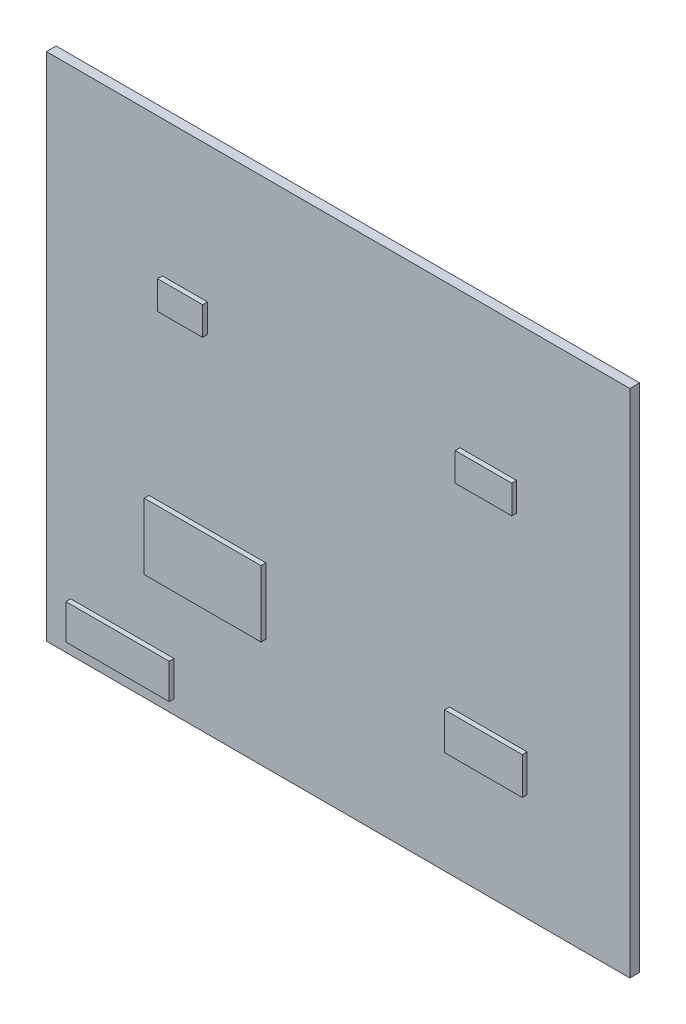
ISO-10303-21;
HEADER;
FILE_DESCRIPTION(('STEP AP214'),'2;1');
FILE_NAME('part.step','',(''),(''),'','','');
FILE_SCHEMA(('AUTOMOTIVE_DESIGN { 1 0 10303 214 1 1 1 1 }'));
ENDSEC;
DATA;
#1=APPLICATION_CONTEXT('core data for automotive mechanical design processes');
#2=APPLICATION_PROTOCOL_DEFINITION('international standard','automotive_design',2000,#1);
#3=PRODUCT_CONTEXT('',#1,'mechanical');
#4=PRODUCT('Part','Part','',(#3));
#5=PRODUCT_RELATED_PRODUCT_CATEGORY('part','',(#4));
#6=PRODUCT_DEFINITION_FORMATION('','',#4);
#7=PRODUCT_DEFINITION_CONTEXT('part definition',#1,'design');
#8=PRODUCT_DEFINITION('design','',#6,#7);
#9=PRODUCT_DEFINITION_SHAPE('','',#8);
#10=(LENGTH_UNIT() NAMED_UNIT(*) SI_UNIT(.MILLI.,.METRE.));
#11=(NAMED_UNIT(*) PLANE_ANGLE_UNIT() SI_UNIT($,.RADIAN.));
#12=(NAMED_UNIT(*) SI_UNIT($,.STERADIAN.) SOLID_ANGLE_UNIT());
#13=UNCERTAINTY_MEASURE_WITH_UNIT(LENGTH_MEASURE(1.E-05),#10,'distance_accuracy_value','');
#14=(GEOMETRIC_REPRESENTATION_CONTEXT(3) GLOBAL_UNCERTAINTY_ASSIGNED_CONTEXT((#13)) GLOBAL_UNIT_ASSIGNED_CONTEXT((#10,
#11,#12)) REPRESENTATION_CONTEXT('',''));
#15=CARTESIAN_POINT('',(0.,0.,0.));
#16=DIRECTION('',(0.,0.,1.));
#17=DIRECTION('',(1.,0.,0.));
#18=AXIS2_PLACEMENT_3D('',#15,#16,#17);
#19=CARTESIAN_POINT('',(0.,0.,2.));
#20=DIRECTION('',(0.,0.,-1.));
#21=DIRECTION('',(-1.,0.,0.));
#22=AXIS2_PLACEMENT_3D('',#19,#20,#21);
#23=PLANE('',#22);
#24=DIRECTION('',(0.,1.,0.));
#25=VECTOR('',#24,1.);
#26=CARTESIAN_POINT('',(36.7081193987389,18.6658341987709,2.));
#27=LINE('',#26,#25);
#28=CARTESIAN_POINT('',(36.7081193987389,18.6658341987709,2.));
#29=VERTEX_POINT('',#28);
#30=CARTESIAN_POINT('',(36.7081193987389,24.4802145211338,2.));
#31=VERTEX_POINT('',#30);
#32=EDGE_CURVE('E217',#29,#31,#27,.T.);
#33=ORIENTED_EDGE('',*,*,#32,.F.);
#34=DIRECTION('',(1.,0.,0.));
#35=VECTOR('',#34,1.);
#36=CARTESIAN_POINT('',(25.0597630125782,18.6658341987709,2.));
#37=LINE('',#36,#35);
#38=CARTESIAN_POINT('',(25.0597630125782,18.6658341987709,2.));
#39=VERTEX_POINT('',#38);
#40=EDGE_CURVE('E230',#39,#29,#37,.T.);
#41=ORIENTED_EDGE('',*,*,#40,.F.);
#42=DIRECTION('',(0.,-1.,0.));
#43=VECTOR('',#42,1.);
#44=CARTESIAN_POINT('',(25.0597630125782,18.6658341987709,2.));
#45=LINE('',#44,#43);
#46=CARTESIAN_POINT('',(25.0597630125782,24.4802145211338,2.));
#47=VERTEX_POINT('',#46);
#48=EDGE_CURVE('E239',#47,#39,#45,.T.);
#49=ORIENTED_EDGE('',*,*,#48,.F.);
#50=DIRECTION('',(-1.,0.,0.));
#51=VECTOR('',#50,1.);
#52=CARTESIAN_POINT('',(25.0597630125782,24.4802145211338,2.));
#53=LINE('',#52,#51);
#54=EDGE_CURVE('E220',#31,#47,#53,.T.);
#55=ORIENTED_EDGE('',*,*,#54,.F.);
#56=EDGE_LOOP('',(#33,#41,#49,#55));
#57=FACE_BOUND('',#56,.T.);
#58=DIRECTION('',(0.,1.,0.));
#59=VECTOR('',#58,1.);
#60=CARTESIAN_POINT('',(38.8723681244443,-30.4180371426241,2.));
#61=LINE('',#60,#59);
#62=CARTESIAN_POINT('',(38.8723681244443,-30.4180371426241,2.));
#63=VERTEX_POINT('',#62);
#64=CARTESIAN_POINT('',(38.8723681244443,-22.7841234165567,2.));
#65=VERTEX_POINT('',#64);
#66=EDGE_CURVE('E288',#63,#65,#61,.T.);
#67=ORIENTED_EDGE('',*,*,#66,.F.);
#68=DIRECTION('',(1.,0.,0.));
#69=VECTOR('',#68,1.);
#70=CARTESIAN_POINT('',(22.8955142868728,-30.4180371426241,2.));
#71=LINE('',#70,#69);
#72=CARTESIAN_POINT('',(22.8955142868728,-30.4180371426241,2.));
#73=VERTEX_POINT('',#72);
#74=EDGE_CURVE('E293',#73,#63,#71,.T.);
#75=ORIENTED_EDGE('',*,*,#74,.F.);
#76=DIRECTION('',(0.,-1.,0.));
#77=VECTOR('',#76,1.);
#78=CARTESIAN_POINT('',(22.8955142868728,-30.4180371426241,2.));
#79=LINE('',#78,#77);
#80=CARTESIAN_POINT('',(22.8955142868728,-22.7841234165567,2.));
#81=VERTEX_POINT('',#80);
#82=EDGE_CURVE('E305',#81,#73,#79,.T.);
#83=ORIENTED_EDGE('',*,*,#82,.F.);
#84=DIRECTION('',(-1.,0.,0.));
#85=VECTOR('',#84,1.);
#86=CARTESIAN_POINT('',(22.8955142868728,-22.7841234165567,2.));
#87=LINE('',#86,#85);
#88=EDGE_CURVE('E302',#65,#81,#87,.T.);
#89=ORIENTED_EDGE('',*,*,#88,.F.);
#90=EDGE_LOOP('',(#67,#75,#83,#89));
#91=FACE_BOUND('',#90,.T.);
#92=DIRECTION('',(0.,1.,0.));
#93=VECTOR('',#92,1.);
#94=CARTESIAN_POINT('',(60.,-52.5,2.));
#95=LINE('',#94,#93);
#96=CARTESIAN_POINT('',(60.,-52.5,2.));
#97=VERTEX_POINT('',#96);
#98=CARTESIAN_POINT('',(60.,52.5,2.));
#99=VERTEX_POINT('',#98);
#100=EDGE_CURVE('E355',#97,#99,#95,.T.);
#101=ORIENTED_EDGE('',*,*,#100,.T.);
#102=DIRECTION('',(-1.,0.,0.));
#103=VECTOR('',#102,1.);
#104=CARTESIAN_POINT('',(-60.,52.5,2.));
#105=LINE('',#104,#103);
#106=CARTESIAN_POINT('',(-60.,52.5,2.));
#107=VERTEX_POINT('',#106);
#108=EDGE_CURVE('E358',#99,#107,#105,.T.);
#109=ORIENTED_EDGE('',*,*,#108,.T.);
#110=DIRECTION('',(0.,-1.,0.));
#111=VECTOR('',#110,1.);
#112=CARTESIAN_POINT('',(-60.,-52.5,2.));
#113=LINE('',#112,#111);
#114=CARTESIAN_POINT('',(-60.,-52.5,2.));
#115=VERTEX_POINT('',#114);
#116=EDGE_CURVE('E361',#107,#115,#113,.T.);
#117=ORIENTED_EDGE('',*,*,#116,.T.);
#118=DIRECTION('',(1.,0.,0.));
#119=VECTOR('',#118,1.);
#120=CARTESIAN_POINT('',(-60.,-52.5,2.));
#121=LINE('',#120,#119);
#122=EDGE_CURVE('E363',#115,#97,#121,.T.);
#123=ORIENTED_EDGE('',*,*,#122,.T.);
#124=EDGE_LOOP('',(#101,#109,#117,#123));
#125=FACE_BOUND('',#124,.T.);
#126=DIRECTION('',(0.,1.,0.));
#127=VECTOR('',#126,1.);
#128=CARTESIAN_POINT('',(-14.8556429378743,-29.5864903580991,2.));
#129=LINE('',#128,#127);
#130=CARTESIAN_POINT('',(-14.8556429378743,-29.5864903580991,2.));
#131=VERTEX_POINT('',#130);
#132=CARTESIAN_POINT('',(-14.8556429378743,-15.9817564750142,2.));
#133=VERTEX_POINT('',#132);
#134=EDGE_CURVE('E321',#131,#133,#129,.T.);
#135=ORIENTED_EDGE('',*,*,#134,.F.);
#136=DIRECTION('',(1.,0.,0.));
#137=VECTOR('',#136,1.);
#138=CARTESIAN_POINT('',(-38.8762767061337,-29.5864903580991,2.));
#139=LINE('',#138,#137);
#140=CARTESIAN_POINT('',(-38.8762767061337,-29.5864903580991,2.));
#141=VERTEX_POINT('',#140);
#142=EDGE_CURVE('E326',#141,#131,#139,.T.);
#143=ORIENTED_EDGE('',*,*,#142,.F.);
#144=DIRECTION('',(0.,-1.,0.));
#145=VECTOR('',#144,1.);
#146=CARTESIAN_POINT('',(-38.8762767061337,-29.5864903580991,2.));
#147=LINE('',#146,#145);
#148=CARTESIAN_POINT('',(-38.8762767061337,-15.9817564750142,2.));
#149=VERTEX_POINT('',#148);
#150=EDGE_CURVE('E338',#149,#141,#147,.T.);
#151=ORIENTED_EDGE('',*,*,#150,.F.);
#152=DIRECTION('',(-1.,0.,0.));
#153=VECTOR('',#152,1.);
#154=CARTESIAN_POINT('',(-38.8762767061337,-15.9817564750142,2.));
#155=LINE('',#154,#153);
#156=EDGE_CURVE('E335',#133,#149,#155,.T.);
#157=ORIENTED_EDGE('',*,*,#156,.F.);
#158=EDGE_LOOP('',(#135,#143,#151,#157));
#159=FACE_BOUND('',#158,.T.);
#160=DIRECTION('',(0.,1.,0.));
#161=VECTOR('',#160,1.);
#162=CARTESIAN_POINT('',(-26.865959822004,18.6658341987709,2.));
#163=LINE('',#162,#161);
#164=CARTESIAN_POINT('',(-26.865959822004,18.6658341987709,2.));
#165=VERTEX_POINT('',#164);
#166=CARTESIAN_POINT('',(-26.865959822004,24.4802145211338,2.));
#167=VERTEX_POINT('',#166);
#168=EDGE_CURVE('E255',#165,#167,#163,.T.);
#169=ORIENTED_EDGE('',*,*,#168,.F.);
#170=DIRECTION('',(1.,0.,0.));
#171=VECTOR('',#170,1.);
#172=CARTESIAN_POINT('',(-36.1530852370606,18.6658341987709,2.));
#173=LINE('',#172,#171);
#174=CARTESIAN_POINT('',(-36.1530852370606,18.6658341987709,2.));
#175=VERTEX_POINT('',#174);
#176=EDGE_CURVE('E260',#175,#165,#173,.T.);
#177=ORIENTED_EDGE('',*,*,#176,.F.);
#178=DIRECTION('',(0.,-1.,0.));
#179=VECTOR('',#178,1.);
#180=CARTESIAN_POINT('',(-36.1530852370606,18.6658341987709,2.));
#181=LINE('',#180,#179);
#182=CARTESIAN_POINT('',(-36.1530852370606,24.4802145211338,2.));
#183=VERTEX_POINT('',#182);
#184=EDGE_CURVE('E272',#183,#175,#181,.T.);
#185=ORIENTED_EDGE('',*,*,#184,.F.);
#186=DIRECTION('',(-1.,0.,0.));
#187=VECTOR('',#186,1.);
#188=CARTESIAN_POINT('',(-36.1530852370606,24.4802145211338,2.));
#189=LINE('',#188,#187);
#190=EDGE_CURVE('E269',#167,#183,#189,.T.);
#191=ORIENTED_EDGE('',*,*,#190,.F.);
#192=EDGE_LOOP('',(#169,#177,#185,#191));
#193=FACE_BOUND('',#192,.T.);
#194=DIRECTION('',(0.,1.,0.));
#195=VECTOR('',#194,1.);
#196=CARTESIAN_POINT('',(-33.7473265030184,-49.6478925465453,2.));
#197=LINE('',#196,#195);
#198=CARTESIAN_POINT('',(-33.7473265030184,-49.6478925465453,2.));
#199=VERTEX_POINT('',#198);
#200=CARTESIAN_POINT('',(-33.7473265030184,-42.4579754762817,2.));
#201=VERTEX_POINT('',#200);
#202=EDGE_CURVE('E216',#199,#201,#197,.T.);
#203=ORIENTED_EDGE('',*,*,#202,.F.);
#204=DIRECTION('',(1.,0.,0.));
#205=VECTOR('',#204,1.);
#206=CARTESIAN_POINT('',(-55.0149263755628,-49.6478925465453,2.));
#207=LINE('',#206,#205);
#208=CARTESIAN_POINT('',(-55.0149263755628,-49.6478925465453,2.));
#209=VERTEX_POINT('',#208);
#210=EDGE_CURVE('E213',#209,#199,#207,.T.);
#211=ORIENTED_EDGE('',*,*,#210,.F.);
#212=DIRECTION('',(0.,-1.,0.));
#213=VECTOR('',#212,1.);
#214=CARTESIAN_POINT('',(-55.0149263755628,-49.6478925465453,2.));
#215=LINE('',#214,#213);
#216=CARTESIAN_POINT('',(-55.0149263755628,-42.4579754762817,2.));
#217=VERTEX_POINT('',#216);
#218=EDGE_CURVE('E55',#217,#209,#215,.T.);
#219=ORIENTED_EDGE('',*,*,#218,.F.);
#220=DIRECTION('',(-1.,0.,0.));
#221=VECTOR('',#220,1.);
#222=CARTESIAN_POINT('',(-55.0149263755628,-42.4579754762817,2.));
#223=LINE('',#222,#221);
#224=EDGE_CURVE('E50',#201,#217,#223,.T.);
#225=ORIENTED_EDGE('',*,*,#224,.F.);
#226=EDGE_LOOP('',(#203,#211,#219,#225));
#227=FACE_BOUND('',#226,.T.);
#228=ADVANCED_FACE('F35',(#57,#91,#125,#159,#193,#227),#23,.F.);
#229=CARTESIAN_POINT('',(60.,-52.5,2.));
#230=DIRECTION('',(-1.,0.,0.));
#231=DIRECTION('',(0.,0.,1.));
#232=AXIS2_PLACEMENT_3D('',#229,#230,#231);
#233=PLANE('',#232);
#234=DIRECTION('',(0.,1.,0.));
#235=VECTOR('',#234,1.);
#236=CARTESIAN_POINT('',(60.,-52.5,0.));
#237=LINE('',#236,#235);
#238=CARTESIAN_POINT('',(60.,-52.5,0.));
#239=VERTEX_POINT('',#238);
#240=CARTESIAN_POINT('',(60.,52.5,0.));
#241=VERTEX_POINT('',#240);
#242=EDGE_CURVE('E354',#239,#241,#237,.T.);
#243=ORIENTED_EDGE('',*,*,#242,.T.);
#244=DIRECTION('',(0.,0.,-1.));
#245=VECTOR('',#244,1.);
#246=CARTESIAN_POINT('',(60.,52.5,2.));
#247=LINE('',#246,#245);
#248=EDGE_CURVE('E11',#99,#241,#247,.T.);
#249=ORIENTED_EDGE('',*,*,#248,.F.);
#250=ORIENTED_EDGE('',*,*,#100,.F.);
#251=DIRECTION('',(0.,0.,-1.));
#252=VECTOR('',#251,1.);
#253=CARTESIAN_POINT('',(60.,-52.5,2.));
#254=LINE('',#253,#252);
#255=EDGE_CURVE('E365',#97,#239,#254,.T.);
#256=ORIENTED_EDGE('',*,*,#255,.T.);
#257=EDGE_LOOP('',(#243,#249,#250,#256));
#258=FACE_BOUND('',#257,.T.);
#259=ADVANCED_FACE('F37',(#258),#233,.F.);
#260=CARTESIAN_POINT('',(-60.,52.5,2.));
#261=DIRECTION('',(0.,-1.,0.));
#262=DIRECTION('',(0.,0.,-1.));
#263=AXIS2_PLACEMENT_3D('',#260,#261,#262);
#264=PLANE('',#263);
#265=DIRECTION('',(-1.,0.,0.));
#266=VECTOR('',#265,1.);
#267=CARTESIAN_POINT('',(-60.,52.5,0.));
#268=LINE('',#267,#266);
#269=CARTESIAN_POINT('',(-60.,52.5,0.));
#270=VERTEX_POINT('',#269);
#271=EDGE_CURVE('E368',#241,#270,#268,.T.);
#272=ORIENTED_EDGE('',*,*,#271,.T.);
#273=DIRECTION('',(0.,0.,-1.));
#274=VECTOR('',#273,1.);
#275=CARTESIAN_POINT('',(-60.,52.5,2.));
#276=LINE('',#275,#274);
#277=EDGE_CURVE('E43',#107,#270,#276,.T.);
#278=ORIENTED_EDGE('',*,*,#277,.F.);
#279=ORIENTED_EDGE('',*,*,#108,.F.);
#280=ORIENTED_EDGE('',*,*,#248,.T.);
#281=EDGE_LOOP('',(#272,#278,#279,#280));
#282=FACE_BOUND('',#281,.T.);
#283=ADVANCED_FACE('F398',(#282),#264,.F.);
#284=CARTESIAN_POINT('',(-60.,-52.5,2.));
#285=DIRECTION('',(1.,0.,0.));
#286=DIRECTION('',(0.,0.,-1.));
#287=AXIS2_PLACEMENT_3D('',#284,#285,#286);
#288=PLANE('',#287);
#289=DIRECTION('',(0.,-1.,0.));
#290=VECTOR('',#289,1.);
#291=CARTESIAN_POINT('',(-60.,-52.5,0.));
#292=LINE('',#291,#290);
#293=CARTESIAN_POINT('',(-60.,-52.5,0.));
#294=VERTEX_POINT('',#293);
#295=EDGE_CURVE('E370',#270,#294,#292,.T.);
#296=ORIENTED_EDGE('',*,*,#295,.T.);
#297=DIRECTION('',(0.,0.,-1.));
#298=VECTOR('',#297,1.);
#299=CARTESIAN_POINT('',(-60.,-52.5,2.));
#300=LINE('',#299,#298);
#301=EDGE_CURVE('E375',#115,#294,#300,.T.);
#302=ORIENTED_EDGE('',*,*,#301,.F.);
#303=ORIENTED_EDGE('',*,*,#116,.F.);
#304=ORIENTED_EDGE('',*,*,#277,.T.);
#305=EDGE_LOOP('',(#296,#302,#303,#304));
#306=FACE_BOUND('',#305,.T.);
#307=ADVANCED_FACE('F382',(#306),#288,.F.);
#308=CARTESIAN_POINT('',(-60.,-52.5,2.));
#309=DIRECTION('',(0.,1.,0.));
#310=DIRECTION('',(0.,0.,1.));
#311=AXIS2_PLACEMENT_3D('',#308,#309,#310);
#312=PLANE('',#311);
#313=DIRECTION('',(1.,0.,0.));
#314=VECTOR('',#313,1.);
#315=CARTESIAN_POINT('',(-60.,-52.5,0.));
#316=LINE('',#315,#314);
#317=EDGE_CURVE('E359',#294,#239,#316,.T.);
#318=ORIENTED_EDGE('',*,*,#317,.T.);
#319=ORIENTED_EDGE('',*,*,#255,.F.);
#320=ORIENTED_EDGE('',*,*,#122,.F.);
#321=ORIENTED_EDGE('',*,*,#301,.T.);
#322=EDGE_LOOP('',(#318,#319,#320,#321));
#323=FACE_BOUND('',#322,.T.);
#324=ADVANCED_FACE('F391',(#323),#312,.F.);
#325=CARTESIAN_POINT('',(0.,0.,0.));
#326=DIRECTION('',(0.,0.,-1.));
#327=DIRECTION('',(-1.,0.,0.));
#328=AXIS2_PLACEMENT_3D('',#325,#326,#327);
#329=PLANE('',#328);
#330=ORIENTED_EDGE('',*,*,#242,.F.);
#331=ORIENTED_EDGE('',*,*,#317,.F.);
#332=ORIENTED_EDGE('',*,*,#295,.F.);
#333=ORIENTED_EDGE('',*,*,#271,.F.);
#334=EDGE_LOOP('',(#330,#331,#332,#333));
#335=FACE_BOUND('',#334,.T.);
#336=ADVANCED_FACE('F388',(#335),#329,.T.);
#337=CARTESIAN_POINT('',(-14.8556429378743,-29.5864903580991,3.));
#338=DIRECTION('',(-1.,0.,0.));
#339=DIRECTION('',(0.,0.,1.));
#340=AXIS2_PLACEMENT_3D('',#337,#338,#339);
#341=PLANE('',#340);
#342=ORIENTED_EDGE('',*,*,#134,.T.);
#343=DIRECTION('',(0.,0.,-1.));
#344=VECTOR('',#343,1.);
#345=CARTESIAN_POINT('',(-14.8556429378743,-15.9817564750142,3.));
#346=LINE('',#345,#344);
#347=CARTESIAN_POINT('',(-14.8556429378743,-15.9817564750142,3.));
#348=VERTEX_POINT('',#347);
#349=EDGE_CURVE('E351',#348,#133,#346,.T.);
#350=ORIENTED_EDGE('',*,*,#349,.F.);
#351=DIRECTION('',(0.,1.,0.));
#352=VECTOR('',#351,1.);
#353=CARTESIAN_POINT('',(-14.8556429378743,-29.5864903580991,3.));
#354=LINE('',#353,#352);
#355=CARTESIAN_POINT('',(-14.8556429378743,-29.5864903580991,3.));
#356=VERTEX_POINT('',#355);
#357=EDGE_CURVE('E322',#356,#348,#354,.T.);
#358=ORIENTED_EDGE('',*,*,#357,.F.);
#359=DIRECTION('',(0.,0.,-1.));
#360=VECTOR('',#359,1.);
#361=CARTESIAN_POINT('',(-14.8556429378743,-29.5864903580991,3.));
#362=LINE('',#361,#360);
#363=EDGE_CURVE('E332',#356,#131,#362,.T.);
#364=ORIENTED_EDGE('',*,*,#363,.T.);
#365=EDGE_LOOP('',(#342,#350,#358,#364));
#366=FACE_BOUND('',#365,.T.);
#367=ADVANCED_FACE('F413',(#366),#341,.F.);
#368=CARTESIAN_POINT('',(-38.8762767061337,-15.9817564750142,3.));
#369=DIRECTION('',(0.,-1.,0.));
#370=DIRECTION('',(0.,0.,-1.));
#371=AXIS2_PLACEMENT_3D('',#368,#369,#370);
#372=PLANE('',#371);
#373=ORIENTED_EDGE('',*,*,#156,.T.);
#374=DIRECTION('',(0.,0.,-1.));
#375=VECTOR('',#374,1.);
#376=CARTESIAN_POINT('',(-38.8762767061337,-15.9817564750142,3.));
#377=LINE('',#376,#375);
#378=CARTESIAN_POINT('',(-38.8762767061337,-15.9817564750142,3.));
#379=VERTEX_POINT('',#378);
#380=EDGE_CURVE('E348',#379,#149,#377,.T.);
#381=ORIENTED_EDGE('',*,*,#380,.F.);
#382=DIRECTION('',(-1.,0.,0.));
#383=VECTOR('',#382,1.);
#384=CARTESIAN_POINT('',(-38.8762767061337,-15.9817564750142,3.));
#385=LINE('',#384,#383);
#386=EDGE_CURVE('E325',#348,#379,#385,.T.);
#387=ORIENTED_EDGE('',*,*,#386,.F.);
#388=ORIENTED_EDGE('',*,*,#349,.T.);
#389=EDGE_LOOP('',(#373,#381,#387,#388));
#390=FACE_BOUND('',#389,.T.);
#391=ADVANCED_FACE('F432',(#390),#372,.F.);
#392=CARTESIAN_POINT('',(-38.8762767061337,-29.5864903580991,3.));
#393=DIRECTION('',(1.,0.,0.));
#394=DIRECTION('',(0.,0.,-1.));
#395=AXIS2_PLACEMENT_3D('',#392,#393,#394);
#396=PLANE('',#395);
#397=ORIENTED_EDGE('',*,*,#150,.T.);
#398=DIRECTION('',(0.,0.,-1.));
#399=VECTOR('',#398,1.);
#400=CARTESIAN_POINT('',(-38.8762767061337,-29.5864903580991,3.));
#401=LINE('',#400,#399);
#402=CARTESIAN_POINT('',(-38.8762767061337,-29.5864903580991,3.));
#403=VERTEX_POINT('',#402);
#404=EDGE_CURVE('E345',#403,#141,#401,.T.);
#405=ORIENTED_EDGE('',*,*,#404,.F.);
#406=DIRECTION('',(0.,-1.,0.));
#407=VECTOR('',#406,1.);
#408=CARTESIAN_POINT('',(-38.8762767061337,-29.5864903580991,3.));
#409=LINE('',#408,#407);
#410=EDGE_CURVE('E328',#379,#403,#409,.T.);
#411=ORIENTED_EDGE('',*,*,#410,.F.);
#412=ORIENTED_EDGE('',*,*,#380,.T.);
#413=EDGE_LOOP('',(#397,#405,#411,#412));
#414=FACE_BOUND('',#413,.T.);
#415=ADVANCED_FACE('F439',(#414),#396,.F.);
#416=CARTESIAN_POINT('',(-38.8762767061337,-29.5864903580991,3.));
#417=DIRECTION('',(0.,1.,0.));
#418=DIRECTION('',(0.,0.,1.));
#419=AXIS2_PLACEMENT_3D('',#416,#417,#418);
#420=PLANE('',#419);
#421=ORIENTED_EDGE('',*,*,#142,.T.);
#422=ORIENTED_EDGE('',*,*,#363,.F.);
#423=DIRECTION('',(1.,0.,0.));
#424=VECTOR('',#423,1.);
#425=CARTESIAN_POINT('',(-38.8762767061337,-29.5864903580991,3.));
#426=LINE('',#425,#424);
#427=EDGE_CURVE('E330',#403,#356,#426,.T.);
#428=ORIENTED_EDGE('',*,*,#427,.F.);
#429=ORIENTED_EDGE('',*,*,#404,.T.);
#430=EDGE_LOOP('',(#421,#422,#428,#429));
#431=FACE_BOUND('',#430,.T.);
#432=ADVANCED_FACE('F446',(#431),#420,.F.);
#433=CARTESIAN_POINT('',(0.,0.,3.));
#434=DIRECTION('',(0.,0.,-1.));
#435=DIRECTION('',(-1.,0.,0.));
#436=AXIS2_PLACEMENT_3D('',#433,#434,#435);
#437=PLANE('',#436);
#438=ORIENTED_EDGE('',*,*,#357,.T.);
#439=ORIENTED_EDGE('',*,*,#386,.T.);
#440=ORIENTED_EDGE('',*,*,#410,.T.);
#441=ORIENTED_EDGE('',*,*,#427,.T.);
#442=EDGE_LOOP('',(#438,#439,#440,#441));
#443=FACE_BOUND('',#442,.T.);
#444=ADVANCED_FACE('F454',(#443),#437,.F.);
#445=CARTESIAN_POINT('',(38.8723681244443,-30.4180371426241,3.));
#446=DIRECTION('',(-1.,0.,0.));
#447=DIRECTION('',(0.,0.,1.));
#448=AXIS2_PLACEMENT_3D('',#445,#446,#447);
#449=PLANE('',#448);
#450=ORIENTED_EDGE('',*,*,#66,.T.);
#451=DIRECTION('',(0.,0.,-1.));
#452=VECTOR('',#451,1.);
#453=CARTESIAN_POINT('',(38.8723681244443,-22.7841234165567,3.));
#454=LINE('',#453,#452);
#455=CARTESIAN_POINT('',(38.8723681244443,-22.7841234165567,3.));
#456=VERTEX_POINT('',#455);
#457=EDGE_CURVE('E318',#456,#65,#454,.T.);
#458=ORIENTED_EDGE('',*,*,#457,.F.);
#459=DIRECTION('',(0.,1.,0.));
#460=VECTOR('',#459,1.);
#461=CARTESIAN_POINT('',(38.8723681244443,-30.4180371426241,3.));
#462=LINE('',#461,#460);
#463=CARTESIAN_POINT('',(38.8723681244443,-30.4180371426241,3.));
#464=VERTEX_POINT('',#463);
#465=EDGE_CURVE('E289',#464,#456,#462,.T.);
#466=ORIENTED_EDGE('',*,*,#465,.F.);
#467=DIRECTION('',(0.,0.,-1.));
#468=VECTOR('',#467,1.);
#469=CARTESIAN_POINT('',(38.8723681244443,-30.4180371426241,3.));
#470=LINE('',#469,#468);
#471=EDGE_CURVE('E299',#464,#63,#470,.T.);
#472=ORIENTED_EDGE('',*,*,#471,.T.);
#473=EDGE_LOOP('',(#450,#458,#466,#472));
#474=FACE_BOUND('',#473,.T.);
#475=ADVANCED_FACE('F462',(#474),#449,.F.);
#476=CARTESIAN_POINT('',(22.8955142868728,-22.7841234165567,3.));
#477=DIRECTION('',(0.,-1.,0.));
#478=DIRECTION('',(0.,0.,-1.));
#479=AXIS2_PLACEMENT_3D('',#476,#477,#478);
#480=PLANE('',#479);
#481=ORIENTED_EDGE('',*,*,#88,.T.);
#482=DIRECTION('',(0.,0.,-1.));
#483=VECTOR('',#482,1.);
#484=CARTESIAN_POINT('',(22.8955142868728,-22.7841234165567,3.));
#485=LINE('',#484,#483);
#486=CARTESIAN_POINT('',(22.8955142868728,-22.7841234165567,3.));
#487=VERTEX_POINT('',#486);
#488=EDGE_CURVE('E315',#487,#81,#485,.T.);
#489=ORIENTED_EDGE('',*,*,#488,.F.);
#490=DIRECTION('',(-1.,0.,0.));
#491=VECTOR('',#490,1.);
#492=CARTESIAN_POINT('',(22.8955142868728,-22.7841234165567,3.));
#493=LINE('',#492,#491);
#494=EDGE_CURVE('E292',#456,#487,#493,.T.);
#495=ORIENTED_EDGE('',*,*,#494,.F.);
#496=ORIENTED_EDGE('',*,*,#457,.T.);
#497=EDGE_LOOP('',(#481,#489,#495,#496));
#498=FACE_BOUND('',#497,.T.);
#499=ADVANCED_FACE('F470',(#498),#480,.F.);
#500=CARTESIAN_POINT('',(22.8955142868728,-30.4180371426241,3.));
#501=DIRECTION('',(1.,0.,0.));
#502=DIRECTION('',(0.,0.,-1.));
#503=AXIS2_PLACEMENT_3D('',#500,#501,#502);
#504=PLANE('',#503);
#505=ORIENTED_EDGE('',*,*,#82,.T.);
#506=DIRECTION('',(0.,0.,-1.));
#507=VECTOR('',#506,1.);
#508=CARTESIAN_POINT('',(22.8955142868728,-30.4180371426241,3.));
#509=LINE('',#508,#507);
#510=CARTESIAN_POINT('',(22.8955142868728,-30.4180371426241,3.));
#511=VERTEX_POINT('',#510);
#512=EDGE_CURVE('E312',#511,#73,#509,.T.);
#513=ORIENTED_EDGE('',*,*,#512,.F.);
#514=DIRECTION('',(0.,-1.,0.));
#515=VECTOR('',#514,1.);
#516=CARTESIAN_POINT('',(22.8955142868728,-30.4180371426241,3.));
#517=LINE('',#516,#515);
#518=EDGE_CURVE('E295',#487,#511,#517,.T.);
#519=ORIENTED_EDGE('',*,*,#518,.F.);
#520=ORIENTED_EDGE('',*,*,#488,.T.);
#521=EDGE_LOOP('',(#505,#513,#519,#520));
#522=FACE_BOUND('',#521,.T.);
#523=ADVANCED_FACE('F478',(#522),#504,.F.);
#524=CARTESIAN_POINT('',(22.8955142868728,-30.4180371426241,3.));
#525=DIRECTION('',(0.,1.,0.));
#526=DIRECTION('',(0.,0.,1.));
#527=AXIS2_PLACEMENT_3D('',#524,#525,#526);
#528=PLANE('',#527);
#529=ORIENTED_EDGE('',*,*,#74,.T.);
#530=ORIENTED_EDGE('',*,*,#471,.F.);
#531=DIRECTION('',(1.,0.,0.));
#532=VECTOR('',#531,1.);
#533=CARTESIAN_POINT('',(22.8955142868728,-30.4180371426241,3.));
#534=LINE('',#533,#532);
#535=EDGE_CURVE('E297',#511,#464,#534,.T.);
#536=ORIENTED_EDGE('',*,*,#535,.F.);
#537=ORIENTED_EDGE('',*,*,#512,.T.);
#538=EDGE_LOOP('',(#529,#530,#536,#537));
#539=FACE_BOUND('',#538,.T.);
#540=ADVANCED_FACE('F486',(#539),#528,.F.);
#541=CARTESIAN_POINT('',(0.,0.,3.));
#542=DIRECTION('',(0.,0.,-1.));
#543=DIRECTION('',(-1.,0.,0.));
#544=AXIS2_PLACEMENT_3D('',#541,#542,#543);
#545=PLANE('',#544);
#546=ORIENTED_EDGE('',*,*,#465,.T.);
#547=ORIENTED_EDGE('',*,*,#494,.T.);
#548=ORIENTED_EDGE('',*,*,#518,.T.);
#549=ORIENTED_EDGE('',*,*,#535,.T.);
#550=EDGE_LOOP('',(#546,#547,#548,#549));
#551=FACE_BOUND('',#550,.T.);
#552=ADVANCED_FACE('F494',(#551),#545,.F.);
#553=CARTESIAN_POINT('',(-26.865959822004,18.6658341987709,3.));
#554=DIRECTION('',(-1.,0.,0.));
#555=DIRECTION('',(0.,0.,1.));
#556=AXIS2_PLACEMENT_3D('',#553,#554,#555);
#557=PLANE('',#556);
#558=ORIENTED_EDGE('',*,*,#168,.T.);
#559=DIRECTION('',(0.,0.,-1.));
#560=VECTOR('',#559,1.);
#561=CARTESIAN_POINT('',(-26.865959822004,24.4802145211338,3.));
#562=LINE('',#561,#560);
#563=CARTESIAN_POINT('',(-26.865959822004,24.4802145211338,3.));
#564=VERTEX_POINT('',#563);
#565=EDGE_CURVE('E285',#564,#167,#562,.T.);
#566=ORIENTED_EDGE('',*,*,#565,.F.);
#567=DIRECTION('',(0.,1.,0.));
#568=VECTOR('',#567,1.);
#569=CARTESIAN_POINT('',(-26.865959822004,18.6658341987709,3.));
#570=LINE('',#569,#568);
#571=CARTESIAN_POINT('',(-26.865959822004,18.6658341987709,3.));
#572=VERTEX_POINT('',#571);
#573=EDGE_CURVE('E256',#572,#564,#570,.T.);
#574=ORIENTED_EDGE('',*,*,#573,.F.);
#575=DIRECTION('',(0.,0.,-1.));
#576=VECTOR('',#575,1.);
#577=CARTESIAN_POINT('',(-26.865959822004,18.6658341987709,3.));
#578=LINE('',#577,#576);
#579=EDGE_CURVE('E266',#572,#165,#578,.T.);
#580=ORIENTED_EDGE('',*,*,#579,.T.);
#581=EDGE_LOOP('',(#558,#566,#574,#580));
#582=FACE_BOUND('',#581,.T.);
#583=ADVANCED_FACE('F502',(#582),#557,.F.);
#584=CARTESIAN_POINT('',(-36.1530852370606,24.4802145211338,3.));
#585=DIRECTION('',(0.,-1.,0.));
#586=DIRECTION('',(0.,0.,-1.));
#587=AXIS2_PLACEMENT_3D('',#584,#585,#586);
#588=PLANE('',#587);
#589=ORIENTED_EDGE('',*,*,#190,.T.);
#590=DIRECTION('',(0.,0.,-1.));
#591=VECTOR('',#590,1.);
#592=CARTESIAN_POINT('',(-36.1530852370606,24.4802145211338,3.));
#593=LINE('',#592,#591);
#594=CARTESIAN_POINT('',(-36.1530852370606,24.4802145211338,3.));
#595=VERTEX_POINT('',#594);
#596=EDGE_CURVE('E282',#595,#183,#593,.T.);
#597=ORIENTED_EDGE('',*,*,#596,.F.);
#598=DIRECTION('',(-1.,0.,0.));
#599=VECTOR('',#598,1.);
#600=CARTESIAN_POINT('',(-36.1530852370606,24.4802145211338,3.));
#601=LINE('',#600,#599);
#602=EDGE_CURVE('E259',#564,#595,#601,.T.);
#603=ORIENTED_EDGE('',*,*,#602,.F.);
#604=ORIENTED_EDGE('',*,*,#565,.T.);
#605=EDGE_LOOP('',(#589,#597,#603,#604));
#606=FACE_BOUND('',#605,.T.);
#607=ADVANCED_FACE('F510',(#606),#588,.F.);
#608=CARTESIAN_POINT('',(-36.1530852370606,18.6658341987709,3.));
#609=DIRECTION('',(1.,0.,0.));
#610=DIRECTION('',(0.,0.,-1.));
#611=AXIS2_PLACEMENT_3D('',#608,#609,#610);
#612=PLANE('',#611);
#613=ORIENTED_EDGE('',*,*,#184,.T.);
#614=DIRECTION('',(0.,0.,-1.));
#615=VECTOR('',#614,1.);
#616=CARTESIAN_POINT('',(-36.1530852370606,18.6658341987709,3.));
#617=LINE('',#616,#615);
#618=CARTESIAN_POINT('',(-36.1530852370606,18.6658341987709,3.));
#619=VERTEX_POINT('',#618);
#620=EDGE_CURVE('E279',#619,#175,#617,.T.);
#621=ORIENTED_EDGE('',*,*,#620,.F.);
#622=DIRECTION('',(0.,-1.,0.));
#623=VECTOR('',#622,1.);
#624=CARTESIAN_POINT('',(-36.1530852370606,18.6658341987709,3.));
#625=LINE('',#624,#623);
#626=EDGE_CURVE('E262',#595,#619,#625,.T.);
#627=ORIENTED_EDGE('',*,*,#626,.F.);
#628=ORIENTED_EDGE('',*,*,#596,.T.);
#629=EDGE_LOOP('',(#613,#621,#627,#628));
#630=FACE_BOUND('',#629,.T.);
#631=ADVANCED_FACE('F518',(#630),#612,.F.);
#632=CARTESIAN_POINT('',(-36.1530852370606,18.6658341987709,3.));
#633=DIRECTION('',(0.,1.,0.));
#634=DIRECTION('',(0.,0.,1.));
#635=AXIS2_PLACEMENT_3D('',#632,#633,#634);
#636=PLANE('',#635);
#637=ORIENTED_EDGE('',*,*,#176,.T.);
#638=ORIENTED_EDGE('',*,*,#579,.F.);
#639=DIRECTION('',(1.,0.,0.));
#640=VECTOR('',#639,1.);
#641=CARTESIAN_POINT('',(-36.1530852370606,18.6658341987709,3.));
#642=LINE('',#641,#640);
#643=EDGE_CURVE('E264',#619,#572,#642,.T.);
#644=ORIENTED_EDGE('',*,*,#643,.F.);
#645=ORIENTED_EDGE('',*,*,#620,.T.);
#646=EDGE_LOOP('',(#637,#638,#644,#645));
#647=FACE_BOUND('',#646,.T.);
#648=ADVANCED_FACE('F526',(#647),#636,.F.);
#649=CARTESIAN_POINT('',(0.,0.,3.));
#650=DIRECTION('',(0.,0.,-1.));
#651=DIRECTION('',(-1.,0.,0.));
#652=AXIS2_PLACEMENT_3D('',#649,#650,#651);
#653=PLANE('',#652);
#654=ORIENTED_EDGE('',*,*,#573,.T.);
#655=ORIENTED_EDGE('',*,*,#602,.T.);
#656=ORIENTED_EDGE('',*,*,#626,.T.);
#657=ORIENTED_EDGE('',*,*,#643,.T.);
#658=EDGE_LOOP('',(#654,#655,#656,#657));
#659=FACE_BOUND('',#658,.T.);
#660=ADVANCED_FACE('F534',(#659),#653,.F.);
#661=CARTESIAN_POINT('',(36.7081193987389,18.6658341987709,3.));
#662=DIRECTION('',(-1.,0.,0.));
#663=DIRECTION('',(0.,0.,1.));
#664=AXIS2_PLACEMENT_3D('',#661,#662,#663);
#665=PLANE('',#664);
#666=ORIENTED_EDGE('',*,*,#32,.T.);
#667=DIRECTION('',(0.,0.,-1.));
#668=VECTOR('',#667,1.);
#669=CARTESIAN_POINT('',(36.7081193987389,24.4802145211338,3.));
#670=LINE('',#669,#668);
#671=CARTESIAN_POINT('',(36.7081193987389,24.4802145211338,3.));
#672=VERTEX_POINT('',#671);
#673=EDGE_CURVE('E252',#672,#31,#670,.T.);
#674=ORIENTED_EDGE('',*,*,#673,.F.);
#675=DIRECTION('',(0.,1.,0.));
#676=VECTOR('',#675,1.);
#677=CARTESIAN_POINT('',(36.7081193987389,18.6658341987709,3.));
#678=LINE('',#677,#676);
#679=CARTESIAN_POINT('',(36.7081193987389,18.6658341987709,3.));
#680=VERTEX_POINT('',#679);
#681=EDGE_CURVE('E226',#680,#672,#678,.T.);
#682=ORIENTED_EDGE('',*,*,#681,.F.);
#683=DIRECTION('',(0.,0.,-1.));
#684=VECTOR('',#683,1.);
#685=CARTESIAN_POINT('',(36.7081193987389,18.6658341987709,3.));
#686=LINE('',#685,#684);
#687=EDGE_CURVE('E235',#680,#29,#686,.T.);
#688=ORIENTED_EDGE('',*,*,#687,.T.);
#689=EDGE_LOOP('',(#666,#674,#682,#688));
#690=FACE_BOUND('',#689,.T.);
#691=ADVANCED_FACE('F542',(#690),#665,.F.);
#692=CARTESIAN_POINT('',(25.0597630125782,24.4802145211338,3.));
#693=DIRECTION('',(0.,-1.,0.));
#694=DIRECTION('',(0.,0.,-1.));
#695=AXIS2_PLACEMENT_3D('',#692,#693,#694);
#696=PLANE('',#695);
#697=ORIENTED_EDGE('',*,*,#54,.T.);
#698=DIRECTION('',(0.,0.,-1.));
#699=VECTOR('',#698,1.);
#700=CARTESIAN_POINT('',(25.0597630125782,24.4802145211338,3.));
#701=LINE('',#700,#699);
#702=CARTESIAN_POINT('',(25.0597630125782,24.4802145211338,3.));
#703=VERTEX_POINT('',#702);
#704=EDGE_CURVE('E249',#703,#47,#701,.T.);
#705=ORIENTED_EDGE('',*,*,#704,.F.);
#706=DIRECTION('',(-1.,0.,0.));
#707=VECTOR('',#706,1.);
#708=CARTESIAN_POINT('',(25.0597630125782,24.4802145211338,3.));
#709=LINE('',#708,#707);
#710=EDGE_CURVE('E229',#672,#703,#709,.T.);
#711=ORIENTED_EDGE('',*,*,#710,.F.);
#712=ORIENTED_EDGE('',*,*,#673,.T.);
#713=EDGE_LOOP('',(#697,#705,#711,#712));
#714=FACE_BOUND('',#713,.T.);
#715=ADVANCED_FACE('F550',(#714),#696,.F.);
#716=CARTESIAN_POINT('',(25.0597630125782,18.6658341987709,3.));
#717=DIRECTION('',(1.,0.,0.));
#718=DIRECTION('',(0.,0.,-1.));
#719=AXIS2_PLACEMENT_3D('',#716,#717,#718);
#720=PLANE('',#719);
#721=ORIENTED_EDGE('',*,*,#48,.T.);
#722=DIRECTION('',(0.,0.,-1.));
#723=VECTOR('',#722,1.);
#724=CARTESIAN_POINT('',(25.0597630125782,18.6658341987709,3.));
#725=LINE('',#724,#723);
#726=CARTESIAN_POINT('',(25.0597630125782,18.6658341987709,3.));
#727=VERTEX_POINT('',#726);
#728=EDGE_CURVE('E246',#727,#39,#725,.T.);
#729=ORIENTED_EDGE('',*,*,#728,.F.);
#730=DIRECTION('',(0.,-1.,0.));
#731=VECTOR('',#730,1.);
#732=CARTESIAN_POINT('',(25.0597630125782,18.6658341987709,3.));
#733=LINE('',#732,#731);
#734=EDGE_CURVE('E232',#703,#727,#733,.T.);
#735=ORIENTED_EDGE('',*,*,#734,.F.);
#736=ORIENTED_EDGE('',*,*,#704,.T.);
#737=EDGE_LOOP('',(#721,#729,#735,#736));
#738=FACE_BOUND('',#737,.T.);
#739=ADVANCED_FACE('F558',(#738),#720,.F.);
#740=CARTESIAN_POINT('',(25.0597630125782,18.6658341987709,3.));
#741=DIRECTION('',(0.,1.,0.));
#742=DIRECTION('',(0.,0.,1.));
#743=AXIS2_PLACEMENT_3D('',#740,#741,#742);
#744=PLANE('',#743);
#745=ORIENTED_EDGE('',*,*,#40,.T.);
#746=ORIENTED_EDGE('',*,*,#687,.F.);
#747=DIRECTION('',(1.,0.,0.));
#748=VECTOR('',#747,1.);
#749=CARTESIAN_POINT('',(25.0597630125782,18.6658341987709,3.));
#750=LINE('',#749,#748);
#751=EDGE_CURVE('E234',#727,#680,#750,.T.);
#752=ORIENTED_EDGE('',*,*,#751,.F.);
#753=ORIENTED_EDGE('',*,*,#728,.T.);
#754=EDGE_LOOP('',(#745,#746,#752,#753));
#755=FACE_BOUND('',#754,.T.);
#756=ADVANCED_FACE('F566',(#755),#744,.F.);
#757=CARTESIAN_POINT('',(0.,0.,3.));
#758=DIRECTION('',(0.,0.,-1.));
#759=DIRECTION('',(-1.,0.,0.));
#760=AXIS2_PLACEMENT_3D('',#757,#758,#759);
#761=PLANE('',#760);
#762=ORIENTED_EDGE('',*,*,#681,.T.);
#763=ORIENTED_EDGE('',*,*,#710,.T.);
#764=ORIENTED_EDGE('',*,*,#734,.T.);
#765=ORIENTED_EDGE('',*,*,#751,.T.);
#766=EDGE_LOOP('',(#762,#763,#764,#765));
#767=FACE_BOUND('',#766,.T.);
#768=ADVANCED_FACE('F574',(#767),#761,.F.);
#769=CARTESIAN_POINT('',(-33.7473265030184,-49.6478925465453,3.));
#770=DIRECTION('',(-1.,0.,0.));
#771=DIRECTION('',(0.,0.,1.));
#772=AXIS2_PLACEMENT_3D('',#769,#770,#771);
#773=PLANE('',#772);
#774=ORIENTED_EDGE('',*,*,#202,.T.);
#775=DIRECTION('',(0.,0.,-1.));
#776=VECTOR('',#775,1.);
#777=CARTESIAN_POINT('',(-33.7473265030184,-42.4579754762817,3.));
#778=LINE('',#777,#776);
#779=CARTESIAN_POINT('',(-33.7473265030184,-42.4579754762817,3.));
#780=VERTEX_POINT('',#779);
#781=EDGE_CURVE('E197',#780,#201,#778,.T.);
#782=ORIENTED_EDGE('',*,*,#781,.F.);
#783=DIRECTION('',(0.,1.,0.));
#784=VECTOR('',#783,1.);
#785=CARTESIAN_POINT('',(-33.7473265030184,-49.6478925465453,3.));
#786=LINE('',#785,#784);
#787=CARTESIAN_POINT('',(-33.7473265030184,-49.6478925465453,3.));
#788=VERTEX_POINT('',#787);
#789=EDGE_CURVE('E204',#788,#780,#786,.T.);
#790=ORIENTED_EDGE('',*,*,#789,.F.);
#791=DIRECTION('',(0.,0.,-1.));
#792=VECTOR('',#791,1.);
#793=CARTESIAN_POINT('',(-33.7473265030184,-49.6478925465453,3.));
#794=LINE('',#793,#792);
#795=EDGE_CURVE('E693',#788,#199,#794,.T.);
#796=ORIENTED_EDGE('',*,*,#795,.T.);
#797=EDGE_LOOP('',(#774,#782,#790,#796));
#798=FACE_BOUND('',#797,.T.);
#799=ADVANCED_FACE('F215',(#798),#773,.F.);
#800=CARTESIAN_POINT('',(-55.0149263755628,-42.4579754762817,3.));
#801=DIRECTION('',(0.,-1.,0.));
#802=DIRECTION('',(0.,0.,-1.));
#803=AXIS2_PLACEMENT_3D('',#800,#801,#802);
#804=PLANE('',#803);
#805=ORIENTED_EDGE('',*,*,#224,.T.);
#806=DIRECTION('',(0.,0.,-1.));
#807=VECTOR('',#806,1.);
#808=CARTESIAN_POINT('',(-55.0149263755628,-42.4579754762817,3.));
#809=LINE('',#808,#807);
#810=CARTESIAN_POINT('',(-55.0149263755628,-42.4579754762817,3.));
#811=VERTEX_POINT('',#810);
#812=EDGE_CURVE('E200',#811,#217,#809,.T.);
#813=ORIENTED_EDGE('',*,*,#812,.F.);
#814=DIRECTION('',(-1.,0.,0.));
#815=VECTOR('',#814,1.);
#816=CARTESIAN_POINT('',(-55.0149263755628,-42.4579754762817,3.));
#817=LINE('',#816,#815);
#818=EDGE_CURVE('E193',#780,#811,#817,.T.);
#819=ORIENTED_EDGE('',*,*,#818,.F.);
#820=ORIENTED_EDGE('',*,*,#781,.T.);
#821=EDGE_LOOP('',(#805,#813,#819,#820));
#822=FACE_BOUND('',#821,.T.);
#823=ADVANCED_FACE('F195',(#822),#804,.F.);
#824=CARTESIAN_POINT('',(-55.0149263755628,-49.6478925465453,3.));
#825=DIRECTION('',(1.,0.,0.));
#826=DIRECTION('',(0.,0.,-1.));
#827=AXIS2_PLACEMENT_3D('',#824,#825,#826);
#828=PLANE('',#827);
#829=ORIENTED_EDGE('',*,*,#218,.T.);
#830=DIRECTION('',(0.,0.,-1.));
#831=VECTOR('',#830,1.);
#832=CARTESIAN_POINT('',(-55.0149263755628,-49.6478925465453,3.));
#833=LINE('',#832,#831);
#834=CARTESIAN_POINT('',(-55.0149263755628,-49.6478925465453,3.));
#835=VERTEX_POINT('',#834);
#836=EDGE_CURVE('E222',#835,#209,#833,.T.);
#837=ORIENTED_EDGE('',*,*,#836,.F.);
#838=DIRECTION('',(0.,-1.,0.));
#839=VECTOR('',#838,1.);
#840=CARTESIAN_POINT('',(-55.0149263755628,-49.6478925465453,3.));
#841=LINE('',#840,#839);
#842=EDGE_CURVE('E203',#811,#835,#841,.T.);
#843=ORIENTED_EDGE('',*,*,#842,.F.);
#844=ORIENTED_EDGE('',*,*,#812,.T.);
#845=EDGE_LOOP('',(#829,#837,#843,#844));
#846=FACE_BOUND('',#845,.T.);
#847=ADVANCED_FACE('F595',(#846),#828,.F.);
#848=CARTESIAN_POINT('',(-55.0149263755628,-49.6478925465453,3.));
#849=DIRECTION('',(0.,1.,0.));
#850=DIRECTION('',(0.,0.,1.));
#851=AXIS2_PLACEMENT_3D('',#848,#849,#850);
#852=PLANE('',#851);
#853=ORIENTED_EDGE('',*,*,#210,.T.);
#854=ORIENTED_EDGE('',*,*,#795,.F.);
#855=DIRECTION('',(1.,0.,0.));
#856=VECTOR('',#855,1.);
#857=CARTESIAN_POINT('',(-55.0149263755628,-49.6478925465453,3.));
#858=LINE('',#857,#856);
#859=EDGE_CURVE('E209',#835,#788,#858,.T.);
#860=ORIENTED_EDGE('',*,*,#859,.F.);
#861=ORIENTED_EDGE('',*,*,#836,.T.);
#862=EDGE_LOOP('',(#853,#854,#860,#861));
#863=FACE_BOUND('',#862,.T.);
#864=ADVANCED_FACE('F602',(#863),#852,.F.);
#865=CARTESIAN_POINT('',(0.,0.,3.));
#866=DIRECTION('',(0.,0.,-1.));
#867=DIRECTION('',(-1.,0.,0.));
#868=AXIS2_PLACEMENT_3D('',#865,#866,#867);
#869=PLANE('',#868);
#870=ORIENTED_EDGE('',*,*,#789,.T.);
#871=ORIENTED_EDGE('',*,*,#818,.T.);
#872=ORIENTED_EDGE('',*,*,#842,.T.);
#873=ORIENTED_EDGE('',*,*,#859,.T.);
#874=EDGE_LOOP('',(#870,#871,#872,#873));
#875=FACE_BOUND('',#874,.T.);
#876=ADVANCED_FACE('F207',(#875),#869,.F.);
#877=CLOSED_SHELL('',(#228,#259,#283,#307,#324,#336,#367,#391,#415,#432,#444,#475,#499,#523,
#540,#552,#583,#607,#631,#648,#660,#691,#715,#739,#756,#768,#799,#823,#847,#864,#876));
#878=MANIFOLD_SOLID_BREP('B2',#877);
#879=ADVANCED_BREP_SHAPE_REPRESENTATION('',(#18,#878),#14);
#880=SHAPE_DEFINITION_REPRESENTATION(#9,#879);
ENDSEC;
END-ISO-10303-21;
